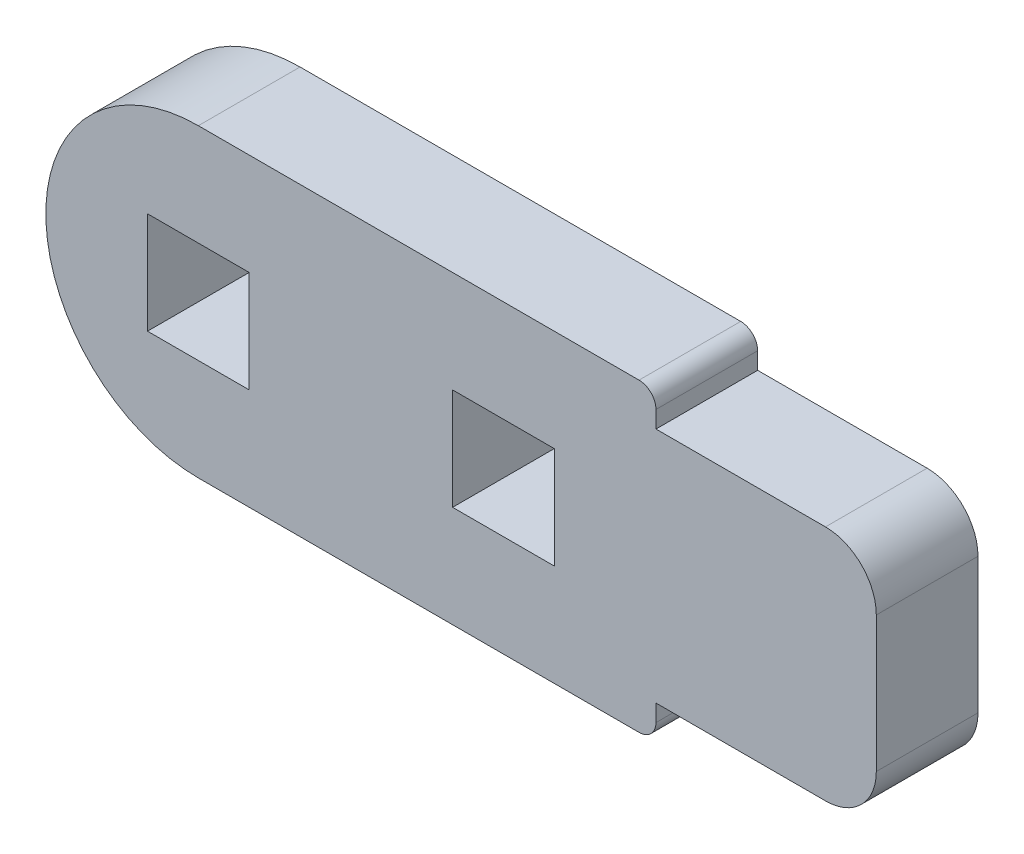
ISO-10303-21;
HEADER;
FILE_DESCRIPTION(('STEP AP214'),'2;1');
FILE_NAME('part.step','',(''),(''),'','','');
FILE_SCHEMA(('AUTOMOTIVE_DESIGN { 1 0 10303 214 1 1 1 1 }'));
ENDSEC;
DATA;
#1=APPLICATION_CONTEXT('core data for automotive mechanical design processes');
#2=APPLICATION_PROTOCOL_DEFINITION('international standard','automotive_design',2000,#1);
#3=PRODUCT_CONTEXT('',#1,'mechanical');
#4=PRODUCT('Part','Part','',(#3));
#5=PRODUCT_RELATED_PRODUCT_CATEGORY('part','',(#4));
#6=PRODUCT_DEFINITION_FORMATION('','',#4);
#7=PRODUCT_DEFINITION_CONTEXT('part definition',#1,'design');
#8=PRODUCT_DEFINITION('design','',#6,#7);
#9=PRODUCT_DEFINITION_SHAPE('','',#8);
#10=(LENGTH_UNIT() NAMED_UNIT(*) SI_UNIT(.MILLI.,.METRE.));
#11=(NAMED_UNIT(*) PLANE_ANGLE_UNIT() SI_UNIT($,.RADIAN.));
#12=(NAMED_UNIT(*) SI_UNIT($,.STERADIAN.) SOLID_ANGLE_UNIT());
#13=UNCERTAINTY_MEASURE_WITH_UNIT(LENGTH_MEASURE(1.E-05),#10,'distance_accuracy_value','');
#14=(GEOMETRIC_REPRESENTATION_CONTEXT(3) GLOBAL_UNCERTAINTY_ASSIGNED_CONTEXT((#13)) GLOBAL_UNIT_ASSIGNED_CONTEXT((#10,
#11,#12)) REPRESENTATION_CONTEXT('',''));
#15=CARTESIAN_POINT('',(0.,0.,0.));
#16=DIRECTION('',(0.,0.,1.));
#17=DIRECTION('',(1.,0.,0.));
#18=AXIS2_PLACEMENT_3D('',#15,#16,#17);
#19=CARTESIAN_POINT('',(30.7815335963,294.1062318612,3.));
#20=DIRECTION('',(0.,0.,1.));
#21=DIRECTION('',(1.,0.,0.));
#22=AXIS2_PLACEMENT_3D('',#19,#20,#21);
#23=PLANE('',#22);
#24=DIRECTION('',(0.,-1.,0.));
#25=VECTOR('',#24,1.);
#26=CARTESIAN_POINT('',(10.7815335963,293.6062318612,3.));
#27=LINE('',#26,#25);
#28=CARTESIAN_POINT('',(10.7815335963,293.6062318612,3.));
#29=VERTEX_POINT('',#28);
#30=CARTESIAN_POINT('',(10.7815335963,290.6062318612,3.));
#31=VERTEX_POINT('',#30);
#32=EDGE_CURVE('E208',#29,#31,#27,.T.);
#33=ORIENTED_EDGE('',*,*,#32,.F.);
#34=DIRECTION('',(-1.,0.,0.));
#35=VECTOR('',#34,1.);
#36=CARTESIAN_POINT('',(13.7815335963,293.6062318612,3.));
#37=LINE('',#36,#35);
#38=CARTESIAN_POINT('',(13.7815335963,293.6062318612,3.));
#39=VERTEX_POINT('',#38);
#40=EDGE_CURVE('E206',#39,#29,#37,.T.);
#41=ORIENTED_EDGE('',*,*,#40,.F.);
#42=DIRECTION('',(0.,1.,0.));
#43=VECTOR('',#42,1.);
#44=CARTESIAN_POINT('',(13.7815335963,290.6062318612,3.));
#45=LINE('',#44,#43);
#46=CARTESIAN_POINT('',(13.7815335963,290.6062318612,3.));
#47=VERTEX_POINT('',#46);
#48=EDGE_CURVE('E214',#47,#39,#45,.T.);
#49=ORIENTED_EDGE('',*,*,#48,.F.);
#50=DIRECTION('',(1.,0.,0.));
#51=VECTOR('',#50,1.);
#52=CARTESIAN_POINT('',(10.7815335963,290.6062318612,3.));
#53=LINE('',#52,#51);
#54=EDGE_CURVE('E211',#31,#47,#53,.T.);
#55=ORIENTED_EDGE('',*,*,#54,.F.);
#56=EDGE_LOOP('',(#33,#41,#49,#55));
#57=FACE_BOUND('',#56,.T.);
#58=CARTESIAN_POINT('',(30.7815335963,294.1062318612,3.));
#59=DIRECTION('',(0.,0.,1.));
#60=DIRECTION('',(1.,0.,0.));
#61=AXIS2_PLACEMENT_3D('',#58,#59,#60);
#62=CIRCLE('',#61,1.5);
#63=CARTESIAN_POINT('',(32.2815335963,294.1062318612,3.));
#64=VERTEX_POINT('',#63);
#65=CARTESIAN_POINT('',(30.7815335963,295.6062318612,3.));
#66=VERTEX_POINT('',#65);
#67=EDGE_CURVE('E237',#64,#66,#62,.T.);
#68=ORIENTED_EDGE('',*,*,#67,.T.);
#69=DIRECTION('',(-1.,0.,0.));
#70=VECTOR('',#69,1.);
#71=CARTESIAN_POINT('',(30.7815335963,295.6062318612,3.));
#72=LINE('',#71,#70);
#73=CARTESIAN_POINT('',(25.7815335963,295.6062318612,3.));
#74=VERTEX_POINT('',#73);
#75=EDGE_CURVE('E240',#66,#74,#72,.T.);
#76=ORIENTED_EDGE('',*,*,#75,.T.);
#77=DIRECTION('',(0.,1.,0.));
#78=VECTOR('',#77,1.);
#79=CARTESIAN_POINT('',(25.7815335963,296.1062318612,3.));
#80=LINE('',#79,#78);
#81=CARTESIAN_POINT('',(25.7815335963,296.1062318612,3.));
#82=VERTEX_POINT('',#81);
#83=EDGE_CURVE('E243',#74,#82,#80,.T.);
#84=ORIENTED_EDGE('',*,*,#83,.T.);
#85=CARTESIAN_POINT('',(25.2815335963,296.1062318612,3.));
#86=DIRECTION('',(0.,0.,1.));
#87=DIRECTION('',(1.,0.,0.));
#88=AXIS2_PLACEMENT_3D('',#85,#86,#87);
#89=CIRCLE('',#88,0.5);
#90=CARTESIAN_POINT('',(25.2815335963,296.6062318612,3.));
#91=VERTEX_POINT('',#90);
#92=EDGE_CURVE('E245',#82,#91,#89,.T.);
#93=ORIENTED_EDGE('',*,*,#92,.T.);
#94=DIRECTION('',(-1.,0.,0.));
#95=VECTOR('',#94,1.);
#96=CARTESIAN_POINT('',(25.2815335963,296.6062318612,3.));
#97=LINE('',#96,#95);
#98=CARTESIAN_POINT('',(12.2815335963,296.6062318612,3.));
#99=VERTEX_POINT('',#98);
#100=EDGE_CURVE('E247',#91,#99,#97,.T.);
#101=ORIENTED_EDGE('',*,*,#100,.T.);
#102=CARTESIAN_POINT('',(12.2815335963,292.1062318612,3.));
#103=DIRECTION('',(0.,0.,1.));
#104=DIRECTION('',(1.,0.,0.));
#105=AXIS2_PLACEMENT_3D('',#102,#103,#104);
#106=CIRCLE('',#105,4.5);
#107=CARTESIAN_POINT('',(12.2815335963,287.6062318612,3.));
#108=VERTEX_POINT('',#107);
#109=EDGE_CURVE('E249',#99,#108,#106,.T.);
#110=ORIENTED_EDGE('',*,*,#109,.T.);
#111=DIRECTION('',(1.,0.,0.));
#112=VECTOR('',#111,1.);
#113=CARTESIAN_POINT('',(25.2815335963,287.6062318612,3.));
#114=LINE('',#113,#112);
#115=CARTESIAN_POINT('',(25.2815335963,287.6062318612,3.));
#116=VERTEX_POINT('',#115);
#117=EDGE_CURVE('E251',#108,#116,#114,.T.);
#118=ORIENTED_EDGE('',*,*,#117,.T.);
#119=CARTESIAN_POINT('',(25.2815335963,288.1062318612,3.));
#120=DIRECTION('',(0.,0.,1.));
#121=DIRECTION('',(1.,0.,0.));
#122=AXIS2_PLACEMENT_3D('',#119,#120,#121);
#123=CIRCLE('',#122,0.5);
#124=CARTESIAN_POINT('',(25.7815335963,288.1062318612,3.));
#125=VERTEX_POINT('',#124);
#126=EDGE_CURVE('E253',#116,#125,#123,.T.);
#127=ORIENTED_EDGE('',*,*,#126,.T.);
#128=DIRECTION('',(0.,1.,0.));
#129=VECTOR('',#128,1.);
#130=CARTESIAN_POINT('',(25.7815335963,288.6062318612,3.));
#131=LINE('',#130,#129);
#132=CARTESIAN_POINT('',(25.7815335963,288.6062318612,3.));
#133=VERTEX_POINT('',#132);
#134=EDGE_CURVE('E255',#125,#133,#131,.T.);
#135=ORIENTED_EDGE('',*,*,#134,.T.);
#136=DIRECTION('',(1.,0.,0.));
#137=VECTOR('',#136,1.);
#138=CARTESIAN_POINT('',(25.7815335963,288.6062318612,3.));
#139=LINE('',#138,#137);
#140=CARTESIAN_POINT('',(30.7815335963,288.6062318612,3.));
#141=VERTEX_POINT('',#140);
#142=EDGE_CURVE('E257',#133,#141,#139,.T.);
#143=ORIENTED_EDGE('',*,*,#142,.T.);
#144=CARTESIAN_POINT('',(30.7815335963,290.1062318612,3.));
#145=DIRECTION('',(0.,0.,1.));
#146=DIRECTION('',(1.,0.,0.));
#147=AXIS2_PLACEMENT_3D('',#144,#145,#146);
#148=CIRCLE('',#147,1.5);
#149=CARTESIAN_POINT('',(32.2815335963,290.1062318612,3.));
#150=VERTEX_POINT('',#149);
#151=EDGE_CURVE('E259',#141,#150,#148,.T.);
#152=ORIENTED_EDGE('',*,*,#151,.T.);
#153=DIRECTION('',(0.,1.,0.));
#154=VECTOR('',#153,1.);
#155=CARTESIAN_POINT('',(32.2815335963,290.1062318612,3.));
#156=LINE('',#155,#154);
#157=EDGE_CURVE('E261',#150,#64,#156,.T.);
#158=ORIENTED_EDGE('',*,*,#157,.T.);
#159=EDGE_LOOP('',(#68,#76,#84,#93,#101,#110,#118,#127,#135,#143,#152,#158));
#160=FACE_BOUND('',#159,.T.);
#161=DIRECTION('',(0.,-1.,0.));
#162=VECTOR('',#161,1.);
#163=CARTESIAN_POINT('',(19.7815335963,293.6062318612,3.));
#164=LINE('',#163,#162);
#165=CARTESIAN_POINT('',(19.7815335963,293.6062318612,3.));
#166=VERTEX_POINT('',#165);
#167=CARTESIAN_POINT('',(19.7815335963,290.6062318612,3.));
#168=VERTEX_POINT('',#167);
#169=EDGE_CURVE('E178',#166,#168,#164,.T.);
#170=ORIENTED_EDGE('',*,*,#169,.F.);
#171=DIRECTION('',(-1.,0.,0.));
#172=VECTOR('',#171,1.);
#173=CARTESIAN_POINT('',(22.7815335963,293.6062318612,3.));
#174=LINE('',#173,#172);
#175=CARTESIAN_POINT('',(22.7815335963,293.6062318612,3.));
#176=VERTEX_POINT('',#175);
#177=EDGE_CURVE('E170',#176,#166,#174,.T.);
#178=ORIENTED_EDGE('',*,*,#177,.F.);
#179=DIRECTION('',(0.,1.,0.));
#180=VECTOR('',#179,1.);
#181=CARTESIAN_POINT('',(22.7815335963,290.6062318612,3.));
#182=LINE('',#181,#180);
#183=CARTESIAN_POINT('',(22.7815335963,290.6062318612,3.));
#184=VERTEX_POINT('',#183);
#185=EDGE_CURVE('E192',#184,#176,#182,.T.);
#186=ORIENTED_EDGE('',*,*,#185,.F.);
#187=DIRECTION('',(1.,0.,0.));
#188=VECTOR('',#187,1.);
#189=CARTESIAN_POINT('',(19.7815335963,290.6062318612,3.));
#190=LINE('',#189,#188);
#191=EDGE_CURVE('E190',#168,#184,#190,.T.);
#192=ORIENTED_EDGE('',*,*,#191,.F.);
#193=EDGE_LOOP('',(#170,#178,#186,#192));
#194=FACE_BOUND('',#193,.T.);
#195=ADVANCED_FACE('F33',(#57,#160,#194),#23,.T.);
#196=CARTESIAN_POINT('',(30.7815335963,294.1062318612,0.));
#197=DIRECTION('',(0.,0.,1.));
#198=DIRECTION('',(1.,0.,0.));
#199=AXIS2_PLACEMENT_3D('',#196,#197,#198);
#200=PLANE('',#199);
#201=DIRECTION('',(-1.,0.,0.));
#202=VECTOR('',#201,1.);
#203=CARTESIAN_POINT('',(13.7815335963,293.6062318612,0.));
#204=LINE('',#203,#202);
#205=CARTESIAN_POINT('',(13.7815335963,293.6062318612,0.));
#206=VERTEX_POINT('',#205);
#207=CARTESIAN_POINT('',(10.7815335963,293.6062318612,0.));
#208=VERTEX_POINT('',#207);
#209=EDGE_CURVE('E186',#206,#208,#204,.T.);
#210=ORIENTED_EDGE('',*,*,#209,.T.);
#211=DIRECTION('',(0.,-1.,0.));
#212=VECTOR('',#211,1.);
#213=CARTESIAN_POINT('',(10.7815335963,293.6062318612,0.));
#214=LINE('',#213,#212);
#215=CARTESIAN_POINT('',(10.7815335963,290.6062318612,0.));
#216=VERTEX_POINT('',#215);
#217=EDGE_CURVE('E219',#208,#216,#214,.T.);
#218=ORIENTED_EDGE('',*,*,#217,.T.);
#219=DIRECTION('',(1.,0.,0.));
#220=VECTOR('',#219,1.);
#221=CARTESIAN_POINT('',(10.7815335963,290.6062318612,0.));
#222=LINE('',#221,#220);
#223=CARTESIAN_POINT('',(13.7815335963,290.6062318612,0.));
#224=VERTEX_POINT('',#223);
#225=EDGE_CURVE('E222',#216,#224,#222,.T.);
#226=ORIENTED_EDGE('',*,*,#225,.T.);
#227=DIRECTION('',(0.,1.,0.));
#228=VECTOR('',#227,1.);
#229=CARTESIAN_POINT('',(13.7815335963,290.6062318612,0.));
#230=LINE('',#229,#228);
#231=EDGE_CURVE('E209',#224,#206,#230,.T.);
#232=ORIENTED_EDGE('',*,*,#231,.T.);
#233=EDGE_LOOP('',(#210,#218,#226,#232));
#234=FACE_BOUND('',#233,.T.);
#235=CARTESIAN_POINT('',(30.7815335963,294.1062318612,0.));
#236=DIRECTION('',(0.,0.,1.));
#237=DIRECTION('',(1.,0.,0.));
#238=AXIS2_PLACEMENT_3D('',#235,#236,#237);
#239=CIRCLE('',#238,1.5);
#240=CARTESIAN_POINT('',(32.2815335963,294.1062318612,0.));
#241=VERTEX_POINT('',#240);
#242=CARTESIAN_POINT('',(30.7815335963,295.6062318612,0.));
#243=VERTEX_POINT('',#242);
#244=EDGE_CURVE('E236',#241,#243,#239,.T.);
#245=ORIENTED_EDGE('',*,*,#244,.F.);
#246=DIRECTION('',(0.,1.,0.));
#247=VECTOR('',#246,1.);
#248=CARTESIAN_POINT('',(32.2815335963,290.1062318612,0.));
#249=LINE('',#248,#247);
#250=CARTESIAN_POINT('',(32.2815335963,290.1062318612,0.));
#251=VERTEX_POINT('',#250);
#252=EDGE_CURVE('E241',#251,#241,#249,.T.);
#253=ORIENTED_EDGE('',*,*,#252,.F.);
#254=CARTESIAN_POINT('',(30.7815335963,290.1062318612,0.));
#255=DIRECTION('',(0.,0.,1.));
#256=DIRECTION('',(1.,0.,0.));
#257=AXIS2_PLACEMENT_3D('',#254,#255,#256);
#258=CIRCLE('',#257,1.5);
#259=CARTESIAN_POINT('',(30.7815335963,288.6062318612,0.));
#260=VERTEX_POINT('',#259);
#261=EDGE_CURVE('E284',#260,#251,#258,.T.);
#262=ORIENTED_EDGE('',*,*,#261,.F.);
#263=DIRECTION('',(1.,0.,0.));
#264=VECTOR('',#263,1.);
#265=CARTESIAN_POINT('',(25.7815335963,288.6062318612,0.));
#266=LINE('',#265,#264);
#267=CARTESIAN_POINT('',(25.7815335963,288.6062318612,0.));
#268=VERTEX_POINT('',#267);
#269=EDGE_CURVE('E282',#268,#260,#266,.T.);
#270=ORIENTED_EDGE('',*,*,#269,.F.);
#271=DIRECTION('',(0.,1.,0.));
#272=VECTOR('',#271,1.);
#273=CARTESIAN_POINT('',(25.7815335963,288.6062318612,0.));
#274=LINE('',#273,#272);
#275=CARTESIAN_POINT('',(25.7815335963,288.1062318612,0.));
#276=VERTEX_POINT('',#275);
#277=EDGE_CURVE('E280',#276,#268,#274,.T.);
#278=ORIENTED_EDGE('',*,*,#277,.F.);
#279=CARTESIAN_POINT('',(25.2815335963,288.1062318612,0.));
#280=DIRECTION('',(0.,0.,1.));
#281=DIRECTION('',(1.,0.,0.));
#282=AXIS2_PLACEMENT_3D('',#279,#280,#281);
#283=CIRCLE('',#282,0.5);
#284=CARTESIAN_POINT('',(25.2815335963,287.6062318612,0.));
#285=VERTEX_POINT('',#284);
#286=EDGE_CURVE('E278',#285,#276,#283,.T.);
#287=ORIENTED_EDGE('',*,*,#286,.F.);
#288=DIRECTION('',(1.,0.,0.));
#289=VECTOR('',#288,1.);
#290=CARTESIAN_POINT('',(25.2815335963,287.6062318612,0.));
#291=LINE('',#290,#289);
#292=CARTESIAN_POINT('',(12.2815335963,287.6062318612,0.));
#293=VERTEX_POINT('',#292);
#294=EDGE_CURVE('E276',#293,#285,#291,.T.);
#295=ORIENTED_EDGE('',*,*,#294,.F.);
#296=CARTESIAN_POINT('',(12.2815335963,292.1062318612,0.));
#297=DIRECTION('',(0.,0.,1.));
#298=DIRECTION('',(1.,0.,0.));
#299=AXIS2_PLACEMENT_3D('',#296,#297,#298);
#300=CIRCLE('',#299,4.5);
#301=CARTESIAN_POINT('',(12.2815335963,296.6062318612,0.));
#302=VERTEX_POINT('',#301);
#303=EDGE_CURVE('E274',#302,#293,#300,.T.);
#304=ORIENTED_EDGE('',*,*,#303,.F.);
#305=DIRECTION('',(-1.,0.,0.));
#306=VECTOR('',#305,1.);
#307=CARTESIAN_POINT('',(25.2815335963,296.6062318612,0.));
#308=LINE('',#307,#306);
#309=CARTESIAN_POINT('',(25.2815335963,296.6062318612,0.));
#310=VERTEX_POINT('',#309);
#311=EDGE_CURVE('E272',#310,#302,#308,.T.);
#312=ORIENTED_EDGE('',*,*,#311,.F.);
#313=CARTESIAN_POINT('',(25.2815335963,296.1062318612,0.));
#314=DIRECTION('',(0.,0.,1.));
#315=DIRECTION('',(1.,0.,0.));
#316=AXIS2_PLACEMENT_3D('',#313,#314,#315);
#317=CIRCLE('',#316,0.5);
#318=CARTESIAN_POINT('',(25.7815335963,296.1062318612,0.));
#319=VERTEX_POINT('',#318);
#320=EDGE_CURVE('E270',#319,#310,#317,.T.);
#321=ORIENTED_EDGE('',*,*,#320,.F.);
#322=DIRECTION('',(0.,1.,0.));
#323=VECTOR('',#322,1.);
#324=CARTESIAN_POINT('',(25.7815335963,296.1062318612,0.));
#325=LINE('',#324,#323);
#326=CARTESIAN_POINT('',(25.7815335963,295.6062318612,0.));
#327=VERTEX_POINT('',#326);
#328=EDGE_CURVE('E268',#327,#319,#325,.T.);
#329=ORIENTED_EDGE('',*,*,#328,.F.);
#330=DIRECTION('',(-1.,0.,0.));
#331=VECTOR('',#330,1.);
#332=CARTESIAN_POINT('',(30.7815335963,295.6062318612,0.));
#333=LINE('',#332,#331);
#334=EDGE_CURVE('E266',#243,#327,#333,.T.);
#335=ORIENTED_EDGE('',*,*,#334,.F.);
#336=EDGE_LOOP('',(#245,#253,#262,#270,#278,#287,#295,#304,#312,#321,#329,#335));
#337=FACE_BOUND('',#336,.T.);
#338=DIRECTION('',(-1.,0.,0.));
#339=VECTOR('',#338,1.);
#340=CARTESIAN_POINT('',(22.7815335963,293.6062318612,0.));
#341=LINE('',#340,#339);
#342=CARTESIAN_POINT('',(22.7815335963,293.6062318612,0.));
#343=VERTEX_POINT('',#342);
#344=CARTESIAN_POINT('',(19.7815335963,293.6062318612,0.));
#345=VERTEX_POINT('',#344);
#346=EDGE_CURVE('E56',#343,#345,#341,.T.);
#347=ORIENTED_EDGE('',*,*,#346,.T.);
#348=DIRECTION('',(0.,-1.,0.));
#349=VECTOR('',#348,1.);
#350=CARTESIAN_POINT('',(19.7815335963,293.6062318612,0.));
#351=LINE('',#350,#349);
#352=CARTESIAN_POINT('',(19.7815335963,290.6062318612,0.));
#353=VERTEX_POINT('',#352);
#354=EDGE_CURVE('E185',#345,#353,#351,.T.);
#355=ORIENTED_EDGE('',*,*,#354,.T.);
#356=DIRECTION('',(1.,0.,0.));
#357=VECTOR('',#356,1.);
#358=CARTESIAN_POINT('',(19.7815335963,290.6062318612,0.));
#359=LINE('',#358,#357);
#360=CARTESIAN_POINT('',(22.7815335963,290.6062318612,0.));
#361=VERTEX_POINT('',#360);
#362=EDGE_CURVE('E198',#353,#361,#359,.T.);
#363=ORIENTED_EDGE('',*,*,#362,.T.);
#364=DIRECTION('',(0.,1.,0.));
#365=VECTOR('',#364,1.);
#366=CARTESIAN_POINT('',(22.7815335963,290.6062318612,0.));
#367=LINE('',#366,#365);
#368=EDGE_CURVE('E179',#361,#343,#367,.T.);
#369=ORIENTED_EDGE('',*,*,#368,.T.);
#370=EDGE_LOOP('',(#347,#355,#363,#369));
#371=FACE_BOUND('',#370,.T.);
#372=ADVANCED_FACE('F326',(#234,#337,#371),#200,.F.);
#373=CARTESIAN_POINT('',(30.7815335963,294.1062318612,3.));
#374=DIRECTION('',(0.,0.,-1.));
#375=DIRECTION('',(-1.,0.,0.));
#376=AXIS2_PLACEMENT_3D('',#373,#374,#375);
#377=CYLINDRICAL_SURFACE('',#376,1.5);
#378=ORIENTED_EDGE('',*,*,#244,.T.);
#379=DIRECTION('',(0.,0.,-1.));
#380=VECTOR('',#379,1.);
#381=CARTESIAN_POINT('',(30.7815335963,295.6062318612,3.));
#382=LINE('',#381,#380);
#383=EDGE_CURVE('E11',#66,#243,#382,.T.);
#384=ORIENTED_EDGE('',*,*,#383,.F.);
#385=ORIENTED_EDGE('',*,*,#67,.F.);
#386=DIRECTION('',(0.,0.,-1.));
#387=VECTOR('',#386,1.);
#388=CARTESIAN_POINT('',(32.2815335963,294.1062318612,3.));
#389=LINE('',#388,#387);
#390=EDGE_CURVE('E263',#64,#241,#389,.T.);
#391=ORIENTED_EDGE('',*,*,#390,.T.);
#392=EDGE_LOOP('',(#378,#384,#385,#391));
#393=FACE_BOUND('',#392,.T.);
#394=ADVANCED_FACE('F35',(#393),#377,.T.);
#395=CARTESIAN_POINT('',(30.7815335963,295.6062318612,3.));
#396=DIRECTION('',(0.,-1.,0.));
#397=DIRECTION('',(0.,0.,-1.));
#398=AXIS2_PLACEMENT_3D('',#395,#396,#397);
#399=PLANE('',#398);
#400=ORIENTED_EDGE('',*,*,#334,.T.);
#401=DIRECTION('',(0.,0.,-1.));
#402=VECTOR('',#401,1.);
#403=CARTESIAN_POINT('',(25.7815335963,295.6062318612,3.));
#404=LINE('',#403,#402);
#405=EDGE_CURVE('E41',#74,#327,#404,.T.);
#406=ORIENTED_EDGE('',*,*,#405,.F.);
#407=ORIENTED_EDGE('',*,*,#75,.F.);
#408=ORIENTED_EDGE('',*,*,#383,.T.);
#409=EDGE_LOOP('',(#400,#406,#407,#408));
#410=FACE_BOUND('',#409,.T.);
#411=ADVANCED_FACE('F343',(#410),#399,.F.);
#412=CARTESIAN_POINT('',(25.7815335963,296.1062318612,3.));
#413=DIRECTION('',(-1.,0.,0.));
#414=DIRECTION('',(0.,0.,1.));
#415=AXIS2_PLACEMENT_3D('',#412,#413,#414);
#416=PLANE('',#415);
#417=ORIENTED_EDGE('',*,*,#328,.T.);
#418=DIRECTION('',(0.,0.,-1.));
#419=VECTOR('',#418,1.);
#420=CARTESIAN_POINT('',(25.7815335963,296.1062318612,3.));
#421=LINE('',#420,#419);
#422=EDGE_CURVE('E313',#82,#319,#421,.T.);
#423=ORIENTED_EDGE('',*,*,#422,.F.);
#424=ORIENTED_EDGE('',*,*,#83,.F.);
#425=ORIENTED_EDGE('',*,*,#405,.T.);
#426=EDGE_LOOP('',(#417,#423,#424,#425));
#427=FACE_BOUND('',#426,.T.);
#428=ADVANCED_FACE('F320',(#427),#416,.F.);
#429=CARTESIAN_POINT('',(25.2815335963,296.1062318612,3.));
#430=DIRECTION('',(0.,0.,-1.));
#431=DIRECTION('',(-1.,0.,0.));
#432=AXIS2_PLACEMENT_3D('',#429,#430,#431);
#433=CYLINDRICAL_SURFACE('',#432,0.5);
#434=ORIENTED_EDGE('',*,*,#320,.T.);
#435=DIRECTION('',(0.,0.,-1.));
#436=VECTOR('',#435,1.);
#437=CARTESIAN_POINT('',(25.2815335963,296.6062318612,3.));
#438=LINE('',#437,#436);
#439=EDGE_CURVE('E310',#91,#310,#438,.T.);
#440=ORIENTED_EDGE('',*,*,#439,.F.);
#441=ORIENTED_EDGE('',*,*,#92,.F.);
#442=ORIENTED_EDGE('',*,*,#422,.T.);
#443=EDGE_LOOP('',(#434,#440,#441,#442));
#444=FACE_BOUND('',#443,.T.);
#445=ADVANCED_FACE('F332',(#444),#433,.T.);
#446=CARTESIAN_POINT('',(25.2815335963,296.6062318612,3.));
#447=DIRECTION('',(0.,-1.,0.));
#448=DIRECTION('',(0.,0.,-1.));
#449=AXIS2_PLACEMENT_3D('',#446,#447,#448);
#450=PLANE('',#449);
#451=ORIENTED_EDGE('',*,*,#311,.T.);
#452=DIRECTION('',(0.,0.,-1.));
#453=VECTOR('',#452,1.);
#454=CARTESIAN_POINT('',(12.2815335963,296.6062318612,3.));
#455=LINE('',#454,#453);
#456=EDGE_CURVE('E307',#99,#302,#455,.T.);
#457=ORIENTED_EDGE('',*,*,#456,.F.);
#458=ORIENTED_EDGE('',*,*,#100,.F.);
#459=ORIENTED_EDGE('',*,*,#439,.T.);
#460=EDGE_LOOP('',(#451,#457,#458,#459));
#461=FACE_BOUND('',#460,.T.);
#462=ADVANCED_FACE('F336',(#461),#450,.F.);
#463=CARTESIAN_POINT('',(12.2815335963,292.1062318612,3.));
#464=DIRECTION('',(0.,0.,-1.));
#465=DIRECTION('',(-1.,0.,0.));
#466=AXIS2_PLACEMENT_3D('',#463,#464,#465);
#467=CYLINDRICAL_SURFACE('',#466,4.5);
#468=ORIENTED_EDGE('',*,*,#303,.T.);
#469=DIRECTION('',(0.,0.,-1.));
#470=VECTOR('',#469,1.);
#471=CARTESIAN_POINT('',(12.2815335963,287.6062318612,3.));
#472=LINE('',#471,#470);
#473=EDGE_CURVE('E304',#108,#293,#472,.T.);
#474=ORIENTED_EDGE('',*,*,#473,.F.);
#475=ORIENTED_EDGE('',*,*,#109,.F.);
#476=ORIENTED_EDGE('',*,*,#456,.T.);
#477=EDGE_LOOP('',(#468,#474,#475,#476));
#478=FACE_BOUND('',#477,.T.);
#479=ADVANCED_FACE('F376',(#478),#467,.T.);
#480=CARTESIAN_POINT('',(25.2815335963,287.6062318612,3.));
#481=DIRECTION('',(0.,1.,0.));
#482=DIRECTION('',(0.,0.,1.));
#483=AXIS2_PLACEMENT_3D('',#480,#481,#482);
#484=PLANE('',#483);
#485=ORIENTED_EDGE('',*,*,#294,.T.);
#486=DIRECTION('',(0.,0.,-1.));
#487=VECTOR('',#486,1.);
#488=CARTESIAN_POINT('',(25.2815335963,287.6062318612,3.));
#489=LINE('',#488,#487);
#490=EDGE_CURVE('E301',#116,#285,#489,.T.);
#491=ORIENTED_EDGE('',*,*,#490,.F.);
#492=ORIENTED_EDGE('',*,*,#117,.F.);
#493=ORIENTED_EDGE('',*,*,#473,.T.);
#494=EDGE_LOOP('',(#485,#491,#492,#493));
#495=FACE_BOUND('',#494,.T.);
#496=ADVANCED_FACE('F374',(#495),#484,.F.);
#497=CARTESIAN_POINT('',(25.2815335963,288.1062318612,3.));
#498=DIRECTION('',(0.,0.,-1.));
#499=DIRECTION('',(-1.,0.,0.));
#500=AXIS2_PLACEMENT_3D('',#497,#498,#499);
#501=CYLINDRICAL_SURFACE('',#500,0.5);
#502=ORIENTED_EDGE('',*,*,#286,.T.);
#503=DIRECTION('',(0.,0.,-1.));
#504=VECTOR('',#503,1.);
#505=CARTESIAN_POINT('',(25.7815335963,288.1062318612,3.));
#506=LINE('',#505,#504);
#507=EDGE_CURVE('E298',#125,#276,#506,.T.);
#508=ORIENTED_EDGE('',*,*,#507,.F.);
#509=ORIENTED_EDGE('',*,*,#126,.F.);
#510=ORIENTED_EDGE('',*,*,#490,.T.);
#511=EDGE_LOOP('',(#502,#508,#509,#510));
#512=FACE_BOUND('',#511,.T.);
#513=ADVANCED_FACE('F370',(#512),#501,.T.);
#514=CARTESIAN_POINT('',(25.7815335963,288.6062318612,3.));
#515=DIRECTION('',(-1.,0.,0.));
#516=DIRECTION('',(0.,0.,1.));
#517=AXIS2_PLACEMENT_3D('',#514,#515,#516);
#518=PLANE('',#517);
#519=ORIENTED_EDGE('',*,*,#277,.T.);
#520=DIRECTION('',(0.,0.,-1.));
#521=VECTOR('',#520,1.);
#522=CARTESIAN_POINT('',(25.7815335963,288.6062318612,3.));
#523=LINE('',#522,#521);
#524=EDGE_CURVE('E295',#133,#268,#523,.T.);
#525=ORIENTED_EDGE('',*,*,#524,.F.);
#526=ORIENTED_EDGE('',*,*,#134,.F.);
#527=ORIENTED_EDGE('',*,*,#507,.T.);
#528=EDGE_LOOP('',(#519,#525,#526,#527));
#529=FACE_BOUND('',#528,.T.);
#530=ADVANCED_FACE('F365',(#529),#518,.F.);
#531=CARTESIAN_POINT('',(25.7815335963,288.6062318612,3.));
#532=DIRECTION('',(0.,1.,0.));
#533=DIRECTION('',(0.,0.,1.));
#534=AXIS2_PLACEMENT_3D('',#531,#532,#533);
#535=PLANE('',#534);
#536=ORIENTED_EDGE('',*,*,#269,.T.);
#537=DIRECTION('',(0.,0.,-1.));
#538=VECTOR('',#537,1.);
#539=CARTESIAN_POINT('',(30.7815335963,288.6062318612,3.));
#540=LINE('',#539,#538);
#541=EDGE_CURVE('E292',#141,#260,#540,.T.);
#542=ORIENTED_EDGE('',*,*,#541,.F.);
#543=ORIENTED_EDGE('',*,*,#142,.F.);
#544=ORIENTED_EDGE('',*,*,#524,.T.);
#545=EDGE_LOOP('',(#536,#542,#543,#544));
#546=FACE_BOUND('',#545,.T.);
#547=ADVANCED_FACE('F359',(#546),#535,.F.);
#548=CARTESIAN_POINT('',(30.7815335963,290.1062318612,3.));
#549=DIRECTION('',(0.,0.,-1.));
#550=DIRECTION('',(-1.,0.,0.));
#551=AXIS2_PLACEMENT_3D('',#548,#549,#550);
#552=CYLINDRICAL_SURFACE('',#551,1.5);
#553=ORIENTED_EDGE('',*,*,#261,.T.);
#554=DIRECTION('',(0.,0.,-1.));
#555=VECTOR('',#554,1.);
#556=CARTESIAN_POINT('',(32.2815335963,290.1062318612,3.));
#557=LINE('',#556,#555);
#558=EDGE_CURVE('E289',#150,#251,#557,.T.);
#559=ORIENTED_EDGE('',*,*,#558,.F.);
#560=ORIENTED_EDGE('',*,*,#151,.F.);
#561=ORIENTED_EDGE('',*,*,#541,.T.);
#562=EDGE_LOOP('',(#553,#559,#560,#561));
#563=FACE_BOUND('',#562,.T.);
#564=ADVANCED_FACE('F355',(#563),#552,.T.);
#565=CARTESIAN_POINT('',(32.2815335963,290.1062318612,3.));
#566=DIRECTION('',(-1.,0.,0.));
#567=DIRECTION('',(0.,0.,1.));
#568=AXIS2_PLACEMENT_3D('',#565,#566,#567);
#569=PLANE('',#568);
#570=ORIENTED_EDGE('',*,*,#252,.T.);
#571=ORIENTED_EDGE('',*,*,#390,.F.);
#572=ORIENTED_EDGE('',*,*,#157,.F.);
#573=ORIENTED_EDGE('',*,*,#558,.T.);
#574=EDGE_LOOP('',(#570,#571,#572,#573));
#575=FACE_BOUND('',#574,.T.);
#576=ADVANCED_FACE('F350',(#575),#569,.F.);
#577=CARTESIAN_POINT('',(13.7815335963,293.6062318612,3.));
#578=DIRECTION('',(0.,-1.,0.));
#579=DIRECTION('',(0.,0.,-1.));
#580=AXIS2_PLACEMENT_3D('',#577,#578,#579);
#581=PLANE('',#580);
#582=ORIENTED_EDGE('',*,*,#209,.F.);
#583=DIRECTION('',(0.,0.,-1.));
#584=VECTOR('',#583,1.);
#585=CARTESIAN_POINT('',(13.7815335963,293.6062318612,3.));
#586=LINE('',#585,#584);
#587=EDGE_CURVE('E216',#39,#206,#586,.T.);
#588=ORIENTED_EDGE('',*,*,#587,.F.);
#589=ORIENTED_EDGE('',*,*,#40,.T.);
#590=DIRECTION('',(0.,0.,-1.));
#591=VECTOR('',#590,1.);
#592=CARTESIAN_POINT('',(10.7815335963,293.6062318612,3.));
#593=LINE('',#592,#591);
#594=EDGE_CURVE('E233',#29,#208,#593,.T.);
#595=ORIENTED_EDGE('',*,*,#594,.T.);
#596=EDGE_LOOP('',(#582,#588,#589,#595));
#597=FACE_BOUND('',#596,.T.);
#598=ADVANCED_FACE('F395',(#597),#581,.T.);
#599=CARTESIAN_POINT('',(10.7815335963,293.6062318612,3.));
#600=DIRECTION('',(1.,0.,0.));
#601=DIRECTION('',(0.,0.,-1.));
#602=AXIS2_PLACEMENT_3D('',#599,#600,#601);
#603=PLANE('',#602);
#604=ORIENTED_EDGE('',*,*,#217,.F.);
#605=ORIENTED_EDGE('',*,*,#594,.F.);
#606=ORIENTED_EDGE('',*,*,#32,.T.);
#607=DIRECTION('',(0.,0.,-1.));
#608=VECTOR('',#607,1.);
#609=CARTESIAN_POINT('',(10.7815335963,290.6062318612,3.));
#610=LINE('',#609,#608);
#611=EDGE_CURVE('E231',#31,#216,#610,.T.);
#612=ORIENTED_EDGE('',*,*,#611,.T.);
#613=EDGE_LOOP('',(#604,#605,#606,#612));
#614=FACE_BOUND('',#613,.T.);
#615=ADVANCED_FACE('F433',(#614),#603,.T.);
#616=CARTESIAN_POINT('',(10.7815335963,290.6062318612,3.));
#617=DIRECTION('',(0.,1.,0.));
#618=DIRECTION('',(0.,0.,1.));
#619=AXIS2_PLACEMENT_3D('',#616,#617,#618);
#620=PLANE('',#619);
#621=ORIENTED_EDGE('',*,*,#225,.F.);
#622=ORIENTED_EDGE('',*,*,#611,.F.);
#623=ORIENTED_EDGE('',*,*,#54,.T.);
#624=DIRECTION('',(0.,0.,-1.));
#625=VECTOR('',#624,1.);
#626=CARTESIAN_POINT('',(13.7815335963,290.6062318612,3.));
#627=LINE('',#626,#625);
#628=EDGE_CURVE('E229',#47,#224,#627,.T.);
#629=ORIENTED_EDGE('',*,*,#628,.T.);
#630=EDGE_LOOP('',(#621,#622,#623,#629));
#631=FACE_BOUND('',#630,.T.);
#632=ADVANCED_FACE('F440',(#631),#620,.T.);
#633=CARTESIAN_POINT('',(13.7815335963,290.6062318612,3.));
#634=DIRECTION('',(-1.,0.,0.));
#635=DIRECTION('',(0.,0.,1.));
#636=AXIS2_PLACEMENT_3D('',#633,#634,#635);
#637=PLANE('',#636);
#638=ORIENTED_EDGE('',*,*,#231,.F.);
#639=ORIENTED_EDGE('',*,*,#628,.F.);
#640=ORIENTED_EDGE('',*,*,#48,.T.);
#641=ORIENTED_EDGE('',*,*,#587,.T.);
#642=EDGE_LOOP('',(#638,#639,#640,#641));
#643=FACE_BOUND('',#642,.T.);
#644=ADVANCED_FACE('F447',(#643),#637,.T.);
#645=CARTESIAN_POINT('',(22.7815335963,293.6062318612,3.));
#646=DIRECTION('',(0.,-1.,0.));
#647=DIRECTION('',(0.,0.,-1.));
#648=AXIS2_PLACEMENT_3D('',#645,#646,#647);
#649=PLANE('',#648);
#650=ORIENTED_EDGE('',*,*,#346,.F.);
#651=DIRECTION('',(0.,0.,-1.));
#652=VECTOR('',#651,1.);
#653=CARTESIAN_POINT('',(22.7815335963,293.6062318612,3.));
#654=LINE('',#653,#652);
#655=EDGE_CURVE('E174',#176,#343,#654,.T.);
#656=ORIENTED_EDGE('',*,*,#655,.F.);
#657=ORIENTED_EDGE('',*,*,#177,.T.);
#658=DIRECTION('',(0.,0.,-1.));
#659=VECTOR('',#658,1.);
#660=CARTESIAN_POINT('',(19.7815335963,293.6062318612,3.));
#661=LINE('',#660,#659);
#662=EDGE_CURVE('E173',#166,#345,#661,.T.);
#663=ORIENTED_EDGE('',*,*,#662,.T.);
#664=EDGE_LOOP('',(#650,#656,#657,#663));
#665=FACE_BOUND('',#664,.T.);
#666=ADVANCED_FACE('F172',(#665),#649,.T.);
#667=CARTESIAN_POINT('',(19.7815335963,293.6062318612,3.));
#668=DIRECTION('',(1.,0.,0.));
#669=DIRECTION('',(0.,0.,-1.));
#670=AXIS2_PLACEMENT_3D('',#667,#668,#669);
#671=PLANE('',#670);
#672=ORIENTED_EDGE('',*,*,#354,.F.);
#673=ORIENTED_EDGE('',*,*,#662,.F.);
#674=ORIENTED_EDGE('',*,*,#169,.T.);
#675=DIRECTION('',(0.,0.,-1.));
#676=VECTOR('',#675,1.);
#677=CARTESIAN_POINT('',(19.7815335963,290.6062318612,3.));
#678=LINE('',#677,#676);
#679=EDGE_CURVE('E187',#168,#353,#678,.T.);
#680=ORIENTED_EDGE('',*,*,#679,.T.);
#681=EDGE_LOOP('',(#672,#673,#674,#680));
#682=FACE_BOUND('',#681,.T.);
#683=ADVANCED_FACE('F182',(#682),#671,.T.);
#684=CARTESIAN_POINT('',(19.7815335963,290.6062318612,3.));
#685=DIRECTION('',(0.,1.,0.));
#686=DIRECTION('',(0.,0.,1.));
#687=AXIS2_PLACEMENT_3D('',#684,#685,#686);
#688=PLANE('',#687);
#689=ORIENTED_EDGE('',*,*,#362,.F.);
#690=ORIENTED_EDGE('',*,*,#679,.F.);
#691=ORIENTED_EDGE('',*,*,#191,.T.);
#692=DIRECTION('',(0.,0.,-1.));
#693=VECTOR('',#692,1.);
#694=CARTESIAN_POINT('',(22.7815335963,290.6062318612,3.));
#695=LINE('',#694,#693);
#696=EDGE_CURVE('E48',#184,#361,#695,.T.);
#697=ORIENTED_EDGE('',*,*,#696,.T.);
#698=EDGE_LOOP('',(#689,#690,#691,#697));
#699=FACE_BOUND('',#698,.T.);
#700=ADVANCED_FACE('F468',(#699),#688,.T.);
#701=CARTESIAN_POINT('',(22.7815335963,290.6062318612,3.));
#702=DIRECTION('',(-1.,0.,0.));
#703=DIRECTION('',(0.,0.,1.));
#704=AXIS2_PLACEMENT_3D('',#701,#702,#703);
#705=PLANE('',#704);
#706=ORIENTED_EDGE('',*,*,#368,.F.);
#707=ORIENTED_EDGE('',*,*,#696,.F.);
#708=ORIENTED_EDGE('',*,*,#185,.T.);
#709=ORIENTED_EDGE('',*,*,#655,.T.);
#710=EDGE_LOOP('',(#706,#707,#708,#709));
#711=FACE_BOUND('',#710,.T.);
#712=ADVANCED_FACE('F475',(#711),#705,.T.);
#713=CLOSED_SHELL('',(#195,#372,#394,#411,#428,#445,#462,#479,#496,#513,#530,#547,#564,#576,
#598,#615,#632,#644,#666,#683,#700,#712));
#714=MANIFOLD_SOLID_BREP('B2',#713);
#715=ADVANCED_BREP_SHAPE_REPRESENTATION('',(#18,#714),#14);
#716=SHAPE_DEFINITION_REPRESENTATION(#9,#715);
ENDSEC;
END-ISO-10303-21;
